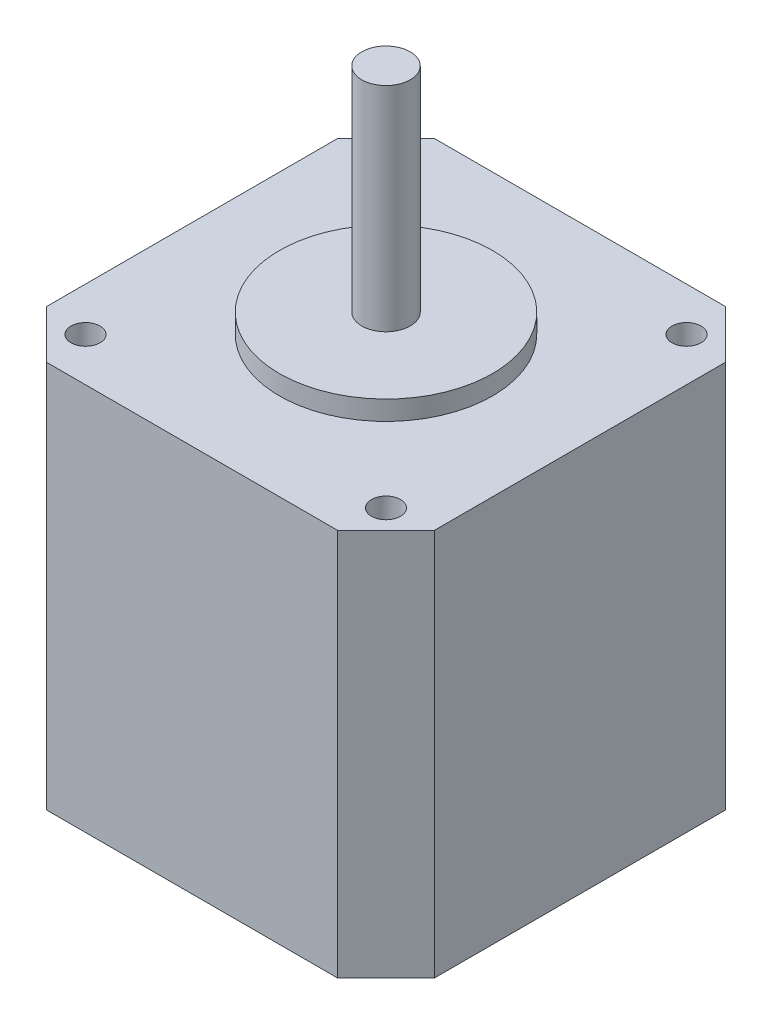
ISO-10303-21;
HEADER;
FILE_DESCRIPTION(('STEP AP214'),'2;1');
FILE_NAME('part.step','',(''),(''),'','','');
FILE_SCHEMA(('AUTOMOTIVE_DESIGN { 1 0 10303 214 1 1 1 1 }'));
ENDSEC;
DATA;
#1=APPLICATION_CONTEXT('core data for automotive mechanical design processes');
#2=APPLICATION_PROTOCOL_DEFINITION('international standard','automotive_design',2000,#1);
#3=PRODUCT_CONTEXT('',#1,'mechanical');
#4=PRODUCT('Part','Part','',(#3));
#5=PRODUCT_RELATED_PRODUCT_CATEGORY('part','',(#4));
#6=PRODUCT_DEFINITION_FORMATION('','',#4);
#7=PRODUCT_DEFINITION_CONTEXT('part definition',#1,'design');
#8=PRODUCT_DEFINITION('design','',#6,#7);
#9=PRODUCT_DEFINITION_SHAPE('','',#8);
#10=(LENGTH_UNIT() NAMED_UNIT(*) SI_UNIT(.MILLI.,.METRE.));
#11=(NAMED_UNIT(*) PLANE_ANGLE_UNIT() SI_UNIT($,.RADIAN.));
#12=(NAMED_UNIT(*) SI_UNIT($,.STERADIAN.) SOLID_ANGLE_UNIT());
#13=UNCERTAINTY_MEASURE_WITH_UNIT(LENGTH_MEASURE(1.E-05),#10,'distance_accuracy_value','');
#14=(GEOMETRIC_REPRESENTATION_CONTEXT(3) GLOBAL_UNCERTAINTY_ASSIGNED_CONTEXT((#13)) GLOBAL_UNIT_ASSIGNED_CONTEXT((#10,
#11,#12)) REPRESENTATION_CONTEXT('',''));
#15=CARTESIAN_POINT('',(0.,0.,0.));
#16=DIRECTION('',(0.,0.,1.));
#17=DIRECTION('',(1.,0.,0.));
#18=AXIS2_PLACEMENT_3D('',#15,#16,#17);
#19=CARTESIAN_POINT('',(20.,42.,-20.));
#20=DIRECTION('',(0.,1.,0.));
#21=DIRECTION('',(0.,0.,1.));
#22=AXIS2_PLACEMENT_3D('',#19,#20,#21);
#23=PLANE('',#22);
#24=CARTESIAN_POINT('',(20.,42.,-20.));
#25=DIRECTION('',(0.,1.,0.));
#26=DIRECTION('',(0.,0.,1.));
#27=AXIS2_PLACEMENT_3D('',#24,#25,#26);
#28=CIRCLE('',#27,11.);
#29=CARTESIAN_POINT('',(20.,42.,-9.));
#30=VERTEX_POINT('',#29);
#31=EDGE_CURVE('E135',#30,#30,#28,.T.);
#32=ORIENTED_EDGE('',*,*,#31,.T.);
#33=EDGE_LOOP('',(#32));
#34=FACE_BOUND('',#33,.T.);
#35=CARTESIAN_POINT('',(20.,42.,-20.));
#36=DIRECTION('',(0.,1.,0.));
#37=DIRECTION('',(0.,0.,1.));
#38=AXIS2_PLACEMENT_3D('',#35,#36,#37);
#39=CIRCLE('',#38,2.5);
#40=CARTESIAN_POINT('',(20.,42.,-17.5));
#41=VERTEX_POINT('',#40);
#42=EDGE_CURVE('E186',#41,#41,#39,.T.);
#43=ORIENTED_EDGE('',*,*,#42,.F.);
#44=EDGE_LOOP('',(#43));
#45=FACE_BOUND('',#44,.T.);
#46=ADVANCED_FACE('F32',(#34,#45),#23,.T.);
#47=CARTESIAN_POINT('',(0.,40.,0.));
#48=DIRECTION('',(0.,-1.,0.));
#49=DIRECTION('',(0.,0.,-1.));
#50=AXIS2_PLACEMENT_3D('',#47,#48,#49);
#51=PLANE('',#50);
#52=CARTESIAN_POINT('',(35.5,40.,-35.5));
#53=DIRECTION('',(0.,-1.,0.));
#54=DIRECTION('',(0.,0.,-1.));
#55=AXIS2_PLACEMENT_3D('',#52,#53,#54);
#56=CIRCLE('',#55,1.5);
#57=CARTESIAN_POINT('',(35.5,40.,-37.));
#58=VERTEX_POINT('',#57);
#59=EDGE_CURVE('E209',#58,#58,#56,.T.);
#60=ORIENTED_EDGE('',*,*,#59,.T.);
#61=EDGE_LOOP('',(#60));
#62=FACE_BOUND('',#61,.T.);
#63=CARTESIAN_POINT('',(35.5,40.,-4.5));
#64=DIRECTION('',(0.,-1.,0.));
#65=DIRECTION('',(0.,0.,-1.));
#66=AXIS2_PLACEMENT_3D('',#63,#64,#65);
#67=CIRCLE('',#66,1.5);
#68=CARTESIAN_POINT('',(35.5,40.,-6.));
#69=VERTEX_POINT('',#68);
#70=EDGE_CURVE('E203',#69,#69,#67,.T.);
#71=ORIENTED_EDGE('',*,*,#70,.T.);
#72=EDGE_LOOP('',(#71));
#73=FACE_BOUND('',#72,.T.);
#74=CARTESIAN_POINT('',(4.5,40.,-35.5));
#75=DIRECTION('',(0.,-1.,0.));
#76=DIRECTION('',(0.,0.,-1.));
#77=AXIS2_PLACEMENT_3D('',#74,#75,#76);
#78=CIRCLE('',#77,1.5);
#79=CARTESIAN_POINT('',(4.5,40.,-37.));
#80=VERTEX_POINT('',#79);
#81=EDGE_CURVE('E197',#80,#80,#78,.T.);
#82=ORIENTED_EDGE('',*,*,#81,.T.);
#83=EDGE_LOOP('',(#82));
#84=FACE_BOUND('',#83,.T.);
#85=CARTESIAN_POINT('',(4.5,40.,-4.5));
#86=DIRECTION('',(0.,-1.,0.));
#87=DIRECTION('',(0.,0.,-1.));
#88=AXIS2_PLACEMENT_3D('',#85,#86,#87);
#89=CIRCLE('',#88,1.5);
#90=CARTESIAN_POINT('',(4.5,40.,-6.));
#91=VERTEX_POINT('',#90);
#92=EDGE_CURVE('E189',#91,#91,#89,.T.);
#93=ORIENTED_EDGE('',*,*,#92,.T.);
#94=EDGE_LOOP('',(#93));
#95=FACE_BOUND('',#94,.T.);
#96=DIRECTION('',(0.,0.,1.));
#97=VECTOR('',#96,1.);
#98=CARTESIAN_POINT('',(0.,40.,-5.));
#99=LINE('',#98,#97);
#100=CARTESIAN_POINT('',(0.,40.,-35.));
#101=VERTEX_POINT('',#100);
#102=CARTESIAN_POINT('',(0.,40.,-5.));
#103=VERTEX_POINT('',#102);
#104=EDGE_CURVE('E146',#101,#103,#99,.T.);
#105=ORIENTED_EDGE('',*,*,#104,.T.);
#106=DIRECTION('',(0.707106781186548,0.,0.707106781186548));
#107=VECTOR('',#106,1.);
#108=CARTESIAN_POINT('',(0.,40.,-5.));
#109=LINE('',#108,#107);
#110=CARTESIAN_POINT('',(5.,40.,0.));
#111=VERTEX_POINT('',#110);
#112=EDGE_CURVE('E93',#103,#111,#109,.T.);
#113=ORIENTED_EDGE('',*,*,#112,.T.);
#114=DIRECTION('',(1.,0.,0.));
#115=VECTOR('',#114,1.);
#116=CARTESIAN_POINT('',(5.,40.,0.));
#117=LINE('',#116,#115);
#118=CARTESIAN_POINT('',(35.,40.,0.));
#119=VERTEX_POINT('',#118);
#120=EDGE_CURVE('E177',#111,#119,#117,.T.);
#121=ORIENTED_EDGE('',*,*,#120,.T.);
#122=DIRECTION('',(0.707106781186547,0.,-0.707106781186548));
#123=VECTOR('',#122,1.);
#124=CARTESIAN_POINT('',(35.,40.,0.));
#125=LINE('',#124,#123);
#126=CARTESIAN_POINT('',(40.,40.,-5.));
#127=VERTEX_POINT('',#126);
#128=EDGE_CURVE('E176',#119,#127,#125,.T.);
#129=ORIENTED_EDGE('',*,*,#128,.T.);
#130=DIRECTION('',(0.,0.,-1.));
#131=VECTOR('',#130,1.);
#132=CARTESIAN_POINT('',(40.,40.,-5.));
#133=LINE('',#132,#131);
#134=CARTESIAN_POINT('',(40.,40.,-35.));
#135=VERTEX_POINT('',#134);
#136=EDGE_CURVE('E113',#127,#135,#133,.T.);
#137=ORIENTED_EDGE('',*,*,#136,.T.);
#138=DIRECTION('',(-0.707106781186547,0.,-0.707106781186547));
#139=VECTOR('',#138,1.);
#140=CARTESIAN_POINT('',(35.,40.,-40.));
#141=LINE('',#140,#139);
#142=CARTESIAN_POINT('',(35.,40.,-40.));
#143=VERTEX_POINT('',#142);
#144=EDGE_CURVE('E106',#135,#143,#141,.T.);
#145=ORIENTED_EDGE('',*,*,#144,.T.);
#146=DIRECTION('',(-1.,0.,0.));
#147=VECTOR('',#146,1.);
#148=CARTESIAN_POINT('',(5.,40.,-40.));
#149=LINE('',#148,#147);
#150=CARTESIAN_POINT('',(5.,40.,-40.));
#151=VERTEX_POINT('',#150);
#152=EDGE_CURVE('E111',#143,#151,#149,.T.);
#153=ORIENTED_EDGE('',*,*,#152,.T.);
#154=DIRECTION('',(-0.707106781186548,0.,0.707106781186547));
#155=VECTOR('',#154,1.);
#156=CARTESIAN_POINT('',(0.,40.,-35.));
#157=LINE('',#156,#155);
#158=EDGE_CURVE('E49',#151,#101,#157,.T.);
#159=ORIENTED_EDGE('',*,*,#158,.T.);
#160=EDGE_LOOP('',(#105,#113,#121,#129,#137,#145,#153,#159));
#161=FACE_BOUND('',#160,.T.);
#162=CARTESIAN_POINT('',(20.,40.,-20.));
#163=DIRECTION('',(0.,-1.,0.));
#164=DIRECTION('',(0.,0.,-1.));
#165=AXIS2_PLACEMENT_3D('',#162,#163,#164);
#166=CIRCLE('',#165,11.);
#167=CARTESIAN_POINT('',(20.,40.,-31.));
#168=VERTEX_POINT('',#167);
#169=EDGE_CURVE('E11',#168,#168,#166,.F.);
#170=ORIENTED_EDGE('',*,*,#169,.F.);
#171=EDGE_LOOP('',(#170));
#172=FACE_BOUND('',#171,.T.);
#173=ADVANCED_FACE('F108',(#62,#73,#84,#95,#161,#172),#51,.F.);
#174=CARTESIAN_POINT('',(0.,40.,-5.));
#175=DIRECTION('',(1.,0.,0.));
#176=DIRECTION('',(0.,0.,-1.));
#177=AXIS2_PLACEMENT_3D('',#174,#175,#176);
#178=PLANE('',#177);
#179=DIRECTION('',(0.,0.,1.));
#180=VECTOR('',#179,1.);
#181=CARTESIAN_POINT('',(0.,0.,-5.));
#182=LINE('',#181,#180);
#183=CARTESIAN_POINT('',(0.,0.,-35.));
#184=VERTEX_POINT('',#183);
#185=CARTESIAN_POINT('',(0.,0.,-5.));
#186=VERTEX_POINT('',#185);
#187=EDGE_CURVE('E131',#184,#186,#182,.T.);
#188=ORIENTED_EDGE('',*,*,#187,.T.);
#189=DIRECTION('',(0.,-1.,0.));
#190=VECTOR('',#189,1.);
#191=CARTESIAN_POINT('',(0.,40.,-5.));
#192=LINE('',#191,#190);
#193=EDGE_CURVE('E41',#103,#186,#192,.T.);
#194=ORIENTED_EDGE('',*,*,#193,.F.);
#195=ORIENTED_EDGE('',*,*,#104,.F.);
#196=DIRECTION('',(0.,-1.,0.));
#197=VECTOR('',#196,1.);
#198=CARTESIAN_POINT('',(0.,40.,-35.));
#199=LINE('',#198,#197);
#200=EDGE_CURVE('E127',#101,#184,#199,.T.);
#201=ORIENTED_EDGE('',*,*,#200,.T.);
#202=EDGE_LOOP('',(#188,#194,#195,#201));
#203=FACE_BOUND('',#202,.T.);
#204=ADVANCED_FACE('F34',(#203),#178,.F.);
#205=CARTESIAN_POINT('',(0.,40.,-5.));
#206=DIRECTION('',(0.707106781186548,0.,-0.707106781186548));
#207=DIRECTION('',(-0.707106781186548,0.,-0.707106781186548));
#208=AXIS2_PLACEMENT_3D('',#205,#206,#207);
#209=PLANE('',#208);
#210=DIRECTION('',(0.707106781186548,0.,0.707106781186548));
#211=VECTOR('',#210,1.);
#212=CARTESIAN_POINT('',(0.,0.,-5.));
#213=LINE('',#212,#211);
#214=CARTESIAN_POINT('',(5.,0.,0.));
#215=VERTEX_POINT('',#214);
#216=EDGE_CURVE('E134',#186,#215,#213,.T.);
#217=ORIENTED_EDGE('',*,*,#216,.T.);
#218=DIRECTION('',(0.,-1.,0.));
#219=VECTOR('',#218,1.);
#220=CARTESIAN_POINT('',(5.,40.,0.));
#221=LINE('',#220,#219);
#222=EDGE_CURVE('E156',#111,#215,#221,.T.);
#223=ORIENTED_EDGE('',*,*,#222,.F.);
#224=ORIENTED_EDGE('',*,*,#112,.F.);
#225=ORIENTED_EDGE('',*,*,#193,.T.);
#226=EDGE_LOOP('',(#217,#223,#224,#225));
#227=FACE_BOUND('',#226,.T.);
#228=ADVANCED_FACE('F159',(#227),#209,.F.);
#229=CARTESIAN_POINT('',(5.,40.,0.));
#230=DIRECTION('',(0.,0.,-1.));
#231=DIRECTION('',(-1.,0.,0.));
#232=AXIS2_PLACEMENT_3D('',#229,#230,#231);
#233=PLANE('',#232);
#234=DIRECTION('',(1.,0.,0.));
#235=VECTOR('',#234,1.);
#236=CARTESIAN_POINT('',(5.,0.,0.));
#237=LINE('',#236,#235);
#238=CARTESIAN_POINT('',(35.,0.,0.));
#239=VERTEX_POINT('',#238);
#240=EDGE_CURVE('E137',#215,#239,#237,.T.);
#241=ORIENTED_EDGE('',*,*,#240,.T.);
#242=DIRECTION('',(0.,-1.,0.));
#243=VECTOR('',#242,1.);
#244=CARTESIAN_POINT('',(35.,40.,0.));
#245=LINE('',#244,#243);
#246=EDGE_CURVE('E153',#119,#239,#245,.T.);
#247=ORIENTED_EDGE('',*,*,#246,.F.);
#248=ORIENTED_EDGE('',*,*,#120,.F.);
#249=ORIENTED_EDGE('',*,*,#222,.T.);
#250=EDGE_LOOP('',(#241,#247,#248,#249));
#251=FACE_BOUND('',#250,.T.);
#252=ADVANCED_FACE('F170',(#251),#233,.F.);
#253=CARTESIAN_POINT('',(35.,40.,0.));
#254=DIRECTION('',(-0.707106781186548,0.,-0.707106781186547));
#255=DIRECTION('',(-0.707106781186547,0.,0.707106781186548));
#256=AXIS2_PLACEMENT_3D('',#253,#254,#255);
#257=PLANE('',#256);
#258=DIRECTION('',(0.707106781186547,0.,-0.707106781186548));
#259=VECTOR('',#258,1.);
#260=CARTESIAN_POINT('',(35.,0.,0.));
#261=LINE('',#260,#259);
#262=CARTESIAN_POINT('',(40.,0.,-5.));
#263=VERTEX_POINT('',#262);
#264=EDGE_CURVE('E139',#239,#263,#261,.T.);
#265=ORIENTED_EDGE('',*,*,#264,.T.);
#266=DIRECTION('',(0.,-1.,0.));
#267=VECTOR('',#266,1.);
#268=CARTESIAN_POINT('',(40.,40.,-5.));
#269=LINE('',#268,#267);
#270=EDGE_CURVE('E150',#127,#263,#269,.T.);
#271=ORIENTED_EDGE('',*,*,#270,.F.);
#272=ORIENTED_EDGE('',*,*,#128,.F.);
#273=ORIENTED_EDGE('',*,*,#246,.T.);
#274=EDGE_LOOP('',(#265,#271,#272,#273));
#275=FACE_BOUND('',#274,.T.);
#276=ADVANCED_FACE('F174',(#275),#257,.F.);
#277=CARTESIAN_POINT('',(40.,40.,-5.));
#278=DIRECTION('',(-1.,0.,0.));
#279=DIRECTION('',(0.,0.,1.));
#280=AXIS2_PLACEMENT_3D('',#277,#278,#279);
#281=PLANE('',#280);
#282=DIRECTION('',(0.,0.,-1.));
#283=VECTOR('',#282,1.);
#284=CARTESIAN_POINT('',(40.,0.,-5.));
#285=LINE('',#284,#283);
#286=CARTESIAN_POINT('',(40.,0.,-35.));
#287=VERTEX_POINT('',#286);
#288=EDGE_CURVE('E141',#263,#287,#285,.T.);
#289=ORIENTED_EDGE('',*,*,#288,.T.);
#290=DIRECTION('',(0.,-1.,0.));
#291=VECTOR('',#290,1.);
#292=CARTESIAN_POINT('',(40.,40.,-35.));
#293=LINE('',#292,#291);
#294=EDGE_CURVE('E122',#135,#287,#293,.T.);
#295=ORIENTED_EDGE('',*,*,#294,.F.);
#296=ORIENTED_EDGE('',*,*,#136,.F.);
#297=ORIENTED_EDGE('',*,*,#270,.T.);
#298=EDGE_LOOP('',(#289,#295,#296,#297));
#299=FACE_BOUND('',#298,.T.);
#300=ADVANCED_FACE('F256',(#299),#281,.F.);
#301=CARTESIAN_POINT('',(35.,40.,-40.));
#302=DIRECTION('',(-0.707106781186548,0.,0.707106781186548));
#303=DIRECTION('',(0.707106781186548,0.,0.707106781186548));
#304=AXIS2_PLACEMENT_3D('',#301,#302,#303);
#305=PLANE('',#304);
#306=DIRECTION('',(-0.707106781186547,0.,-0.707106781186547));
#307=VECTOR('',#306,1.);
#308=CARTESIAN_POINT('',(35.,0.,-40.));
#309=LINE('',#308,#307);
#310=CARTESIAN_POINT('',(35.,0.,-40.));
#311=VERTEX_POINT('',#310);
#312=EDGE_CURVE('E121',#287,#311,#309,.T.);
#313=ORIENTED_EDGE('',*,*,#312,.T.);
#314=DIRECTION('',(0.,-1.,0.));
#315=VECTOR('',#314,1.);
#316=CARTESIAN_POINT('',(35.,40.,-40.));
#317=LINE('',#316,#315);
#318=EDGE_CURVE('E118',#143,#311,#317,.T.);
#319=ORIENTED_EDGE('',*,*,#318,.F.);
#320=ORIENTED_EDGE('',*,*,#144,.F.);
#321=ORIENTED_EDGE('',*,*,#294,.T.);
#322=EDGE_LOOP('',(#313,#319,#320,#321));
#323=FACE_BOUND('',#322,.T.);
#324=ADVANCED_FACE('F119',(#323),#305,.F.);
#325=CARTESIAN_POINT('',(5.,40.,-40.));
#326=DIRECTION('',(0.,0.,1.));
#327=DIRECTION('',(1.,0.,0.));
#328=AXIS2_PLACEMENT_3D('',#325,#326,#327);
#329=PLANE('',#328);
#330=DIRECTION('',(-1.,0.,0.));
#331=VECTOR('',#330,1.);
#332=CARTESIAN_POINT('',(5.,0.,-40.));
#333=LINE('',#332,#331);
#334=CARTESIAN_POINT('',(5.,0.,-40.));
#335=VERTEX_POINT('',#334);
#336=EDGE_CURVE('E78',#311,#335,#333,.T.);
#337=ORIENTED_EDGE('',*,*,#336,.T.);
#338=DIRECTION('',(0.,-1.,0.));
#339=VECTOR('',#338,1.);
#340=CARTESIAN_POINT('',(5.,40.,-40.));
#341=LINE('',#340,#339);
#342=EDGE_CURVE('E123',#151,#335,#341,.T.);
#343=ORIENTED_EDGE('',*,*,#342,.F.);
#344=ORIENTED_EDGE('',*,*,#152,.F.);
#345=ORIENTED_EDGE('',*,*,#318,.T.);
#346=EDGE_LOOP('',(#337,#343,#344,#345));
#347=FACE_BOUND('',#346,.T.);
#348=ADVANCED_FACE('F125',(#347),#329,.F.);
#349=CARTESIAN_POINT('',(0.,40.,-35.));
#350=DIRECTION('',(0.707106781186547,0.,0.707106781186548));
#351=DIRECTION('',(0.707106781186548,0.,-0.707106781186547));
#352=AXIS2_PLACEMENT_3D('',#349,#350,#351);
#353=PLANE('',#352);
#354=DIRECTION('',(-0.707106781186548,0.,0.707106781186547));
#355=VECTOR('',#354,1.);
#356=CARTESIAN_POINT('',(0.,0.,-35.));
#357=LINE('',#356,#355);
#358=EDGE_CURVE('E84',#335,#184,#357,.T.);
#359=ORIENTED_EDGE('',*,*,#358,.T.);
#360=ORIENTED_EDGE('',*,*,#200,.F.);
#361=ORIENTED_EDGE('',*,*,#158,.F.);
#362=ORIENTED_EDGE('',*,*,#342,.T.);
#363=EDGE_LOOP('',(#359,#360,#361,#362));
#364=FACE_BOUND('',#363,.T.);
#365=ADVANCED_FACE('F222',(#364),#353,.F.);
#366=CARTESIAN_POINT('',(0.,0.,0.));
#367=DIRECTION('',(0.,-1.,0.));
#368=DIRECTION('',(0.,0.,-1.));
#369=AXIS2_PLACEMENT_3D('',#366,#367,#368);
#370=PLANE('',#369);
#371=CARTESIAN_POINT('',(35.5,0.,-35.5));
#372=DIRECTION('',(0.,-1.,0.));
#373=DIRECTION('',(0.,0.,-1.));
#374=AXIS2_PLACEMENT_3D('',#371,#372,#373);
#375=CIRCLE('',#374,1.5);
#376=CARTESIAN_POINT('',(35.5,0.,-37.));
#377=VERTEX_POINT('',#376);
#378=EDGE_CURVE('E212',#377,#377,#375,.T.);
#379=ORIENTED_EDGE('',*,*,#378,.F.);
#380=EDGE_LOOP('',(#379));
#381=FACE_BOUND('',#380,.T.);
#382=CARTESIAN_POINT('',(35.5,0.,-4.5));
#383=DIRECTION('',(0.,-1.,0.));
#384=DIRECTION('',(0.,0.,-1.));
#385=AXIS2_PLACEMENT_3D('',#382,#383,#384);
#386=CIRCLE('',#385,1.5);
#387=CARTESIAN_POINT('',(35.5,0.,-6.));
#388=VERTEX_POINT('',#387);
#389=EDGE_CURVE('E206',#388,#388,#386,.T.);
#390=ORIENTED_EDGE('',*,*,#389,.F.);
#391=EDGE_LOOP('',(#390));
#392=FACE_BOUND('',#391,.T.);
#393=CARTESIAN_POINT('',(4.5,0.,-35.5));
#394=DIRECTION('',(0.,-1.,0.));
#395=DIRECTION('',(0.,0.,-1.));
#396=AXIS2_PLACEMENT_3D('',#393,#394,#395);
#397=CIRCLE('',#396,1.5);
#398=CARTESIAN_POINT('',(4.5,0.,-37.));
#399=VERTEX_POINT('',#398);
#400=EDGE_CURVE('E200',#399,#399,#397,.T.);
#401=ORIENTED_EDGE('',*,*,#400,.F.);
#402=EDGE_LOOP('',(#401));
#403=FACE_BOUND('',#402,.T.);
#404=CARTESIAN_POINT('',(4.5,0.,-4.5));
#405=DIRECTION('',(0.,-1.,0.));
#406=DIRECTION('',(0.,0.,-1.));
#407=AXIS2_PLACEMENT_3D('',#404,#405,#406);
#408=CIRCLE('',#407,1.5);
#409=CARTESIAN_POINT('',(4.5,0.,-6.));
#410=VERTEX_POINT('',#409);
#411=EDGE_CURVE('E194',#410,#410,#408,.T.);
#412=ORIENTED_EDGE('',*,*,#411,.F.);
#413=EDGE_LOOP('',(#412));
#414=FACE_BOUND('',#413,.T.);
#415=ORIENTED_EDGE('',*,*,#187,.F.);
#416=ORIENTED_EDGE('',*,*,#358,.F.);
#417=ORIENTED_EDGE('',*,*,#336,.F.);
#418=ORIENTED_EDGE('',*,*,#312,.F.);
#419=ORIENTED_EDGE('',*,*,#288,.F.);
#420=ORIENTED_EDGE('',*,*,#264,.F.);
#421=ORIENTED_EDGE('',*,*,#240,.F.);
#422=ORIENTED_EDGE('',*,*,#216,.F.);
#423=EDGE_LOOP('',(#415,#416,#417,#418,#419,#420,#421,#422));
#424=FACE_BOUND('',#423,.T.);
#425=ADVANCED_FACE('F164',(#381,#392,#403,#414,#424),#370,.T.);
#426=CARTESIAN_POINT('',(20.,42.,-20.));
#427=DIRECTION('',(0.,-1.,0.));
#428=DIRECTION('',(0.,0.,-1.));
#429=AXIS2_PLACEMENT_3D('',#426,#427,#428);
#430=CYLINDRICAL_SURFACE('',#429,11.);
#431=ORIENTED_EDGE('',*,*,#31,.F.);
#432=EDGE_LOOP('',(#431));
#433=FACE_BOUND('',#432,.T.);
#434=ORIENTED_EDGE('',*,*,#169,.T.);
#435=EDGE_LOOP('',(#434));
#436=FACE_BOUND('',#435,.T.);
#437=ADVANCED_FACE('F221',(#433,#436),#430,.T.);
#438=CARTESIAN_POINT('',(20.,64.,-20.));
#439=DIRECTION('',(0.,-1.,0.));
#440=DIRECTION('',(0.,0.,-1.));
#441=AXIS2_PLACEMENT_3D('',#438,#439,#440);
#442=CYLINDRICAL_SURFACE('',#441,2.5);
#443=CARTESIAN_POINT('',(20.,64.,-20.));
#444=DIRECTION('',(0.,1.,0.));
#445=DIRECTION('',(0.,0.,1.));
#446=AXIS2_PLACEMENT_3D('',#443,#444,#445);
#447=CIRCLE('',#446,2.5);
#448=CARTESIAN_POINT('',(20.,64.,-17.5));
#449=VERTEX_POINT('',#448);
#450=EDGE_CURVE('E185',#449,#449,#447,.T.);
#451=ORIENTED_EDGE('',*,*,#450,.F.);
#452=EDGE_LOOP('',(#451));
#453=FACE_BOUND('',#452,.T.);
#454=ORIENTED_EDGE('',*,*,#42,.T.);
#455=EDGE_LOOP('',(#454));
#456=FACE_BOUND('',#455,.T.);
#457=ADVANCED_FACE('F303',(#453,#456),#442,.T.);
#458=CARTESIAN_POINT('',(20.,64.,-20.));
#459=DIRECTION('',(0.,1.,0.));
#460=DIRECTION('',(0.,0.,1.));
#461=AXIS2_PLACEMENT_3D('',#458,#459,#460);
#462=PLANE('',#461);
#463=ORIENTED_EDGE('',*,*,#450,.T.);
#464=EDGE_LOOP('',(#463));
#465=FACE_BOUND('',#464,.T.);
#466=ADVANCED_FACE('F234',(#465),#462,.T.);
#467=CARTESIAN_POINT('',(4.5,64.,-4.5));
#468=DIRECTION('',(0.,-1.,0.));
#469=DIRECTION('',(0.,0.,-1.));
#470=AXIS2_PLACEMENT_3D('',#467,#468,#469);
#471=CYLINDRICAL_SURFACE('',#470,1.5);
#472=ORIENTED_EDGE('',*,*,#411,.T.);
#473=EDGE_LOOP('',(#472));
#474=FACE_BOUND('',#473,.T.);
#475=ORIENTED_EDGE('',*,*,#92,.F.);
#476=EDGE_LOOP('',(#475));
#477=FACE_BOUND('',#476,.T.);
#478=ADVANCED_FACE('F230',(#474,#477),#471,.F.);
#479=CARTESIAN_POINT('',(4.5,64.,-35.5));
#480=DIRECTION('',(0.,-1.,0.));
#481=DIRECTION('',(0.,0.,-1.));
#482=AXIS2_PLACEMENT_3D('',#479,#480,#481);
#483=CYLINDRICAL_SURFACE('',#482,1.5);
#484=ORIENTED_EDGE('',*,*,#400,.T.);
#485=EDGE_LOOP('',(#484));
#486=FACE_BOUND('',#485,.T.);
#487=ORIENTED_EDGE('',*,*,#81,.F.);
#488=EDGE_LOOP('',(#487));
#489=FACE_BOUND('',#488,.T.);
#490=ADVANCED_FACE('F233',(#486,#489),#483,.F.);
#491=CARTESIAN_POINT('',(35.5,64.,-4.5));
#492=DIRECTION('',(0.,-1.,0.));
#493=DIRECTION('',(0.,0.,-1.));
#494=AXIS2_PLACEMENT_3D('',#491,#492,#493);
#495=CYLINDRICAL_SURFACE('',#494,1.5);
#496=ORIENTED_EDGE('',*,*,#389,.T.);
#497=EDGE_LOOP('',(#496));
#498=FACE_BOUND('',#497,.T.);
#499=ORIENTED_EDGE('',*,*,#70,.F.);
#500=EDGE_LOOP('',(#499));
#501=FACE_BOUND('',#500,.T.);
#502=ADVANCED_FACE('F328',(#498,#501),#495,.F.);
#503=CARTESIAN_POINT('',(35.5,64.,-35.5));
#504=DIRECTION('',(0.,-1.,0.));
#505=DIRECTION('',(0.,0.,-1.));
#506=AXIS2_PLACEMENT_3D('',#503,#504,#505);
#507=CYLINDRICAL_SURFACE('',#506,1.5);
#508=ORIENTED_EDGE('',*,*,#378,.T.);
#509=EDGE_LOOP('',(#508));
#510=FACE_BOUND('',#509,.T.);
#511=ORIENTED_EDGE('',*,*,#59,.F.);
#512=EDGE_LOOP('',(#511));
#513=FACE_BOUND('',#512,.T.);
#514=ADVANCED_FACE('F216',(#510,#513),#507,.F.);
#515=CLOSED_SHELL('',(#46,#173,#204,#228,#252,#276,#300,#324,#348,#365,#425,#437,#457,#466,#478,
#490,#502,#514));
#516=MANIFOLD_SOLID_BREP('B2',#515);
#517=ADVANCED_BREP_SHAPE_REPRESENTATION('',(#18,#516),#14);
#518=SHAPE_DEFINITION_REPRESENTATION(#9,#517);
ENDSEC;
END-ISO-10303-21;
